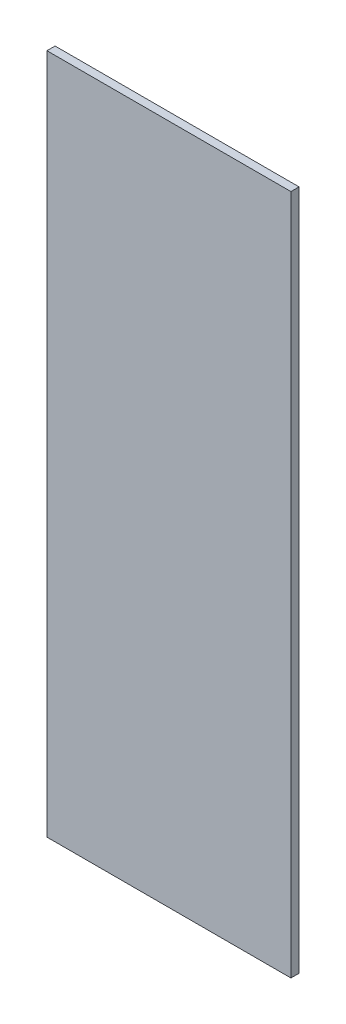
ISO-10303-21;
HEADER;
FILE_DESCRIPTION(('STEP AP214'),'2;1');
FILE_NAME('part.step','',(''),(''),'','','');
FILE_SCHEMA(('AUTOMOTIVE_DESIGN { 1 0 10303 214 1 1 1 1 }'));
ENDSEC;
DATA;
#1=APPLICATION_CONTEXT('core data for automotive mechanical design processes');
#2=APPLICATION_PROTOCOL_DEFINITION('international standard','automotive_design',2000,#1);
#3=PRODUCT_CONTEXT('',#1,'mechanical');
#4=PRODUCT('Part','Part','',(#3));
#5=PRODUCT_RELATED_PRODUCT_CATEGORY('part','',(#4));
#6=PRODUCT_DEFINITION_FORMATION('','',#4);
#7=PRODUCT_DEFINITION_CONTEXT('part definition',#1,'design');
#8=PRODUCT_DEFINITION('design','',#6,#7);
#9=PRODUCT_DEFINITION_SHAPE('','',#8);
#10=(LENGTH_UNIT() NAMED_UNIT(*) SI_UNIT(.MILLI.,.METRE.));
#11=(NAMED_UNIT(*) PLANE_ANGLE_UNIT() SI_UNIT($,.RADIAN.));
#12=(NAMED_UNIT(*) SI_UNIT($,.STERADIAN.) SOLID_ANGLE_UNIT());
#13=UNCERTAINTY_MEASURE_WITH_UNIT(LENGTH_MEASURE(1.E-05),#10,'distance_accuracy_value','');
#14=(GEOMETRIC_REPRESENTATION_CONTEXT(3) GLOBAL_UNCERTAINTY_ASSIGNED_CONTEXT((#13)) GLOBAL_UNIT_ASSIGNED_CONTEXT((#10,
#11,#12)) REPRESENTATION_CONTEXT('',''));
#15=CARTESIAN_POINT('',(0.,0.,0.));
#16=DIRECTION('',(0.,0.,1.));
#17=DIRECTION('',(1.,0.,0.));
#18=AXIS2_PLACEMENT_3D('',#15,#16,#17);
#19=CARTESIAN_POINT('',(0.,568.796983514716,0.));
#20=DIRECTION('',(1.,0.,0.));
#21=DIRECTION('',(0.,0.,-1.));
#22=AXIS2_PLACEMENT_3D('',#19,#20,#21);
#23=PLANE('',#22);
#24=DIRECTION('',(0.,0.,1.));
#25=VECTOR('',#24,1.);
#26=CARTESIAN_POINT('',(0.,418.713673316679,0.));
#27=LINE('',#26,#25);
#28=CARTESIAN_POINT('',(0.,418.713673316679,0.));
#29=VERTEX_POINT('',#28);
#30=CARTESIAN_POINT('',(0.,418.713673316679,5.));
#31=VERTEX_POINT('',#30);
#32=EDGE_CURVE('E81',#29,#31,#27,.T.);
#33=ORIENTED_EDGE('',*,*,#32,.F.);
#34=DIRECTION('',(0.,-1.,0.));
#35=VECTOR('',#34,1.);
#36=CARTESIAN_POINT('',(0.,568.796983514716,0.));
#37=LINE('',#36,#35);
#38=CARTESIAN_POINT('',(0.,0.,0.));
#39=VERTEX_POINT('',#38);
#40=EDGE_CURVE('E35',#29,#39,#37,.T.);
#41=ORIENTED_EDGE('',*,*,#40,.T.);
#42=DIRECTION('',(0.,0.,1.));
#43=VECTOR('',#42,1.);
#44=CARTESIAN_POINT('',(0.,0.,0.));
#45=LINE('',#44,#43);
#46=CARTESIAN_POINT('',(0.,0.,5.));
#47=VERTEX_POINT('',#46);
#48=EDGE_CURVE('E79',#39,#47,#45,.T.);
#49=ORIENTED_EDGE('',*,*,#48,.T.);
#50=DIRECTION('',(0.,-1.,0.));
#51=VECTOR('',#50,1.);
#52=CARTESIAN_POINT('',(0.,568.796983514716,5.));
#53=LINE('',#52,#51);
#54=EDGE_CURVE('E70',#31,#47,#53,.T.);
#55=ORIENTED_EDGE('',*,*,#54,.F.);
#56=EDGE_LOOP('',(#33,#41,#49,#55));
#57=FACE_BOUND('',#56,.T.);
#58=ADVANCED_FACE('F31',(#57),#23,.F.);
#59=CARTESIAN_POINT('',(0.,568.796983514716,5.));
#60=DIRECTION('',(0.,0.,-1.));
#61=DIRECTION('',(-1.,0.,0.));
#62=AXIS2_PLACEMENT_3D('',#59,#60,#61);
#63=PLANE('',#62);
#64=DIRECTION('',(1.,0.,0.));
#65=VECTOR('',#64,1.);
#66=CARTESIAN_POINT('',(0.,418.713673316679,5.));
#67=LINE('',#66,#65);
#68=CARTESIAN_POINT('',(150.,418.713673316679,5.));
#69=VERTEX_POINT('',#68);
#70=EDGE_CURVE('E40',#31,#69,#67,.T.);
#71=ORIENTED_EDGE('',*,*,#70,.F.);
#72=ORIENTED_EDGE('',*,*,#54,.T.);
#73=DIRECTION('',(1.,0.,0.));
#74=VECTOR('',#73,1.);
#75=CARTESIAN_POINT('',(0.,0.,5.));
#76=LINE('',#75,#74);
#77=CARTESIAN_POINT('',(150.,0.,5.));
#78=VERTEX_POINT('',#77);
#79=EDGE_CURVE('E91',#47,#78,#76,.T.);
#80=ORIENTED_EDGE('',*,*,#79,.T.);
#81=DIRECTION('',(0.,-1.,0.));
#82=VECTOR('',#81,1.);
#83=CARTESIAN_POINT('',(150.,568.796983514716,5.));
#84=LINE('',#83,#82);
#85=EDGE_CURVE('E100',#69,#78,#84,.T.);
#86=ORIENTED_EDGE('',*,*,#85,.F.);
#87=EDGE_LOOP('',(#71,#72,#80,#86));
#88=FACE_BOUND('',#87,.T.);
#89=ADVANCED_FACE('F104',(#88),#63,.F.);
#90=CARTESIAN_POINT('',(150.,568.796983514716,0.));
#91=DIRECTION('',(-1.,0.,0.));
#92=DIRECTION('',(0.,0.,1.));
#93=AXIS2_PLACEMENT_3D('',#90,#91,#92);
#94=PLANE('',#93);
#95=DIRECTION('',(0.,0.,-1.));
#96=VECTOR('',#95,1.);
#97=CARTESIAN_POINT('',(150.,418.713673316679,0.));
#98=LINE('',#97,#96);
#99=CARTESIAN_POINT('',(150.,418.713673316679,0.));
#100=VERTEX_POINT('',#99);
#101=EDGE_CURVE('E11',#69,#100,#98,.T.);
#102=ORIENTED_EDGE('',*,*,#101,.F.);
#103=ORIENTED_EDGE('',*,*,#85,.T.);
#104=DIRECTION('',(0.,0.,-1.));
#105=VECTOR('',#104,1.);
#106=CARTESIAN_POINT('',(150.,0.,0.));
#107=LINE('',#106,#105);
#108=CARTESIAN_POINT('',(150.,0.,0.));
#109=VERTEX_POINT('',#108);
#110=EDGE_CURVE('E101',#78,#109,#107,.T.);
#111=ORIENTED_EDGE('',*,*,#110,.T.);
#112=DIRECTION('',(0.,-1.,0.));
#113=VECTOR('',#112,1.);
#114=CARTESIAN_POINT('',(150.,568.796983514716,0.));
#115=LINE('',#114,#113);
#116=EDGE_CURVE('E53',#100,#109,#115,.T.);
#117=ORIENTED_EDGE('',*,*,#116,.F.);
#118=EDGE_LOOP('',(#102,#103,#111,#117));
#119=FACE_BOUND('',#118,.T.);
#120=ADVANCED_FACE('F103',(#119),#94,.F.);
#121=CARTESIAN_POINT('',(0.,568.796983514716,0.));
#122=DIRECTION('',(0.,0.,1.));
#123=DIRECTION('',(1.,0.,0.));
#124=AXIS2_PLACEMENT_3D('',#121,#122,#123);
#125=PLANE('',#124);
#126=DIRECTION('',(-1.,0.,0.));
#127=VECTOR('',#126,1.);
#128=CARTESIAN_POINT('',(0.,418.713673316679,0.));
#129=LINE('',#128,#127);
#130=EDGE_CURVE('E88',#100,#29,#129,.T.);
#131=ORIENTED_EDGE('',*,*,#130,.F.);
#132=ORIENTED_EDGE('',*,*,#116,.T.);
#133=DIRECTION('',(-1.,0.,0.));
#134=VECTOR('',#133,1.);
#135=CARTESIAN_POINT('',(0.,0.,0.));
#136=LINE('',#135,#134);
#137=EDGE_CURVE('E84',#109,#39,#136,.T.);
#138=ORIENTED_EDGE('',*,*,#137,.T.);
#139=ORIENTED_EDGE('',*,*,#40,.F.);
#140=EDGE_LOOP('',(#131,#132,#138,#139));
#141=FACE_BOUND('',#140,.T.);
#142=ADVANCED_FACE('F85',(#141),#125,.F.);
#143=CARTESIAN_POINT('',(0.,0.,5.));
#144=DIRECTION('',(0.,1.,0.));
#145=DIRECTION('',(0.,0.,1.));
#146=AXIS2_PLACEMENT_3D('',#143,#144,#145);
#147=PLANE('',#146);
#148=ORIENTED_EDGE('',*,*,#48,.F.);
#149=ORIENTED_EDGE('',*,*,#137,.F.);
#150=ORIENTED_EDGE('',*,*,#110,.F.);
#151=ORIENTED_EDGE('',*,*,#79,.F.);
#152=EDGE_LOOP('',(#148,#149,#150,#151));
#153=FACE_BOUND('',#152,.T.);
#154=ADVANCED_FACE('F90',(#153),#147,.F.);
#155=CARTESIAN_POINT('',(117.415806647967,418.713673316679,-115.224699525976));
#156=DIRECTION('',(0.,1.,0.));
#157=DIRECTION('',(-1.,0.,0.));
#158=AXIS2_PLACEMENT_3D('',#155,#156,#157);
#159=PLANE('',#158);
#160=ORIENTED_EDGE('',*,*,#130,.T.);
#161=ORIENTED_EDGE('',*,*,#32,.T.);
#162=ORIENTED_EDGE('',*,*,#70,.T.);
#163=ORIENTED_EDGE('',*,*,#101,.T.);
#164=EDGE_LOOP('',(#160,#161,#162,#163));
#165=FACE_BOUND('',#164,.T.);
#166=ADVANCED_FACE('F33',(#165),#159,.T.);
#167=CLOSED_SHELL('',(#58,#89,#120,#142,#154,#166));
#168=MANIFOLD_SOLID_BREP('B2',#167);
#169=ADVANCED_BREP_SHAPE_REPRESENTATION('',(#18,#168),#14);
#170=SHAPE_DEFINITION_REPRESENTATION(#9,#169);
ENDSEC;
END-ISO-10303-21;
